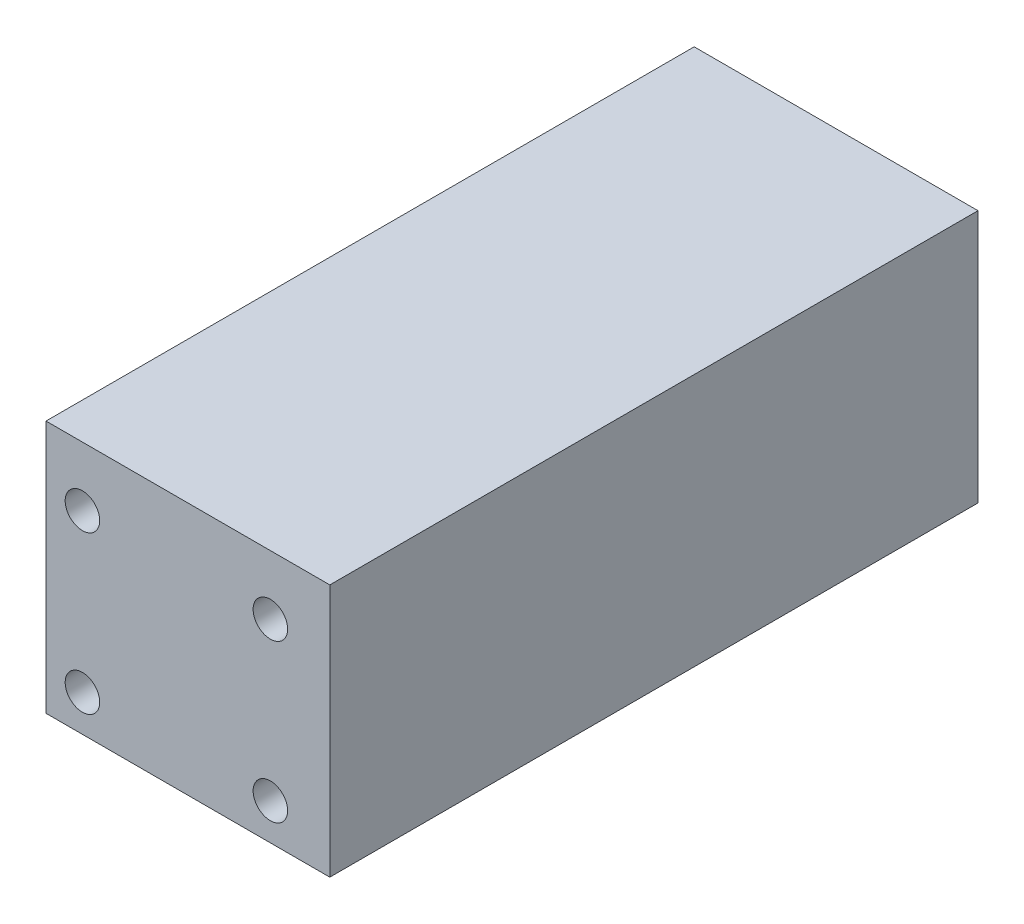
ISO-10303-21;
HEADER;
FILE_DESCRIPTION(('STEP AP214'),'2;1');
FILE_NAME('part.step','',(''),(''),'','','');
FILE_SCHEMA(('AUTOMOTIVE_DESIGN { 1 0 10303 214 1 1 1 1 }'));
ENDSEC;
DATA;
#1=APPLICATION_CONTEXT('core data for automotive mechanical design processes');
#2=APPLICATION_PROTOCOL_DEFINITION('international standard','automotive_design',2000,#1);
#3=PRODUCT_CONTEXT('',#1,'mechanical');
#4=PRODUCT('Part','Part','',(#3));
#5=PRODUCT_RELATED_PRODUCT_CATEGORY('part','',(#4));
#6=PRODUCT_DEFINITION_FORMATION('','',#4);
#7=PRODUCT_DEFINITION_CONTEXT('part definition',#1,'design');
#8=PRODUCT_DEFINITION('design','',#6,#7);
#9=PRODUCT_DEFINITION_SHAPE('','',#8);
#10=(LENGTH_UNIT() NAMED_UNIT(*) SI_UNIT(.MILLI.,.METRE.));
#11=(NAMED_UNIT(*) PLANE_ANGLE_UNIT() SI_UNIT($,.RADIAN.));
#12=(NAMED_UNIT(*) SI_UNIT($,.STERADIAN.) SOLID_ANGLE_UNIT());
#13=UNCERTAINTY_MEASURE_WITH_UNIT(LENGTH_MEASURE(1.E-05),#10,'distance_accuracy_value','');
#14=(GEOMETRIC_REPRESENTATION_CONTEXT(3) GLOBAL_UNCERTAINTY_ASSIGNED_CONTEXT((#13)) GLOBAL_UNIT_ASSIGNED_CONTEXT((#10,
#11,#12)) REPRESENTATION_CONTEXT('',''));
#15=CARTESIAN_POINT('',(0.,0.,0.));
#16=DIRECTION('',(0.,0.,1.));
#17=DIRECTION('',(1.,0.,0.));
#18=AXIS2_PLACEMENT_3D('',#15,#16,#17);
#19=CARTESIAN_POINT('',(34.,0.,134.078221024962));
#20=DIRECTION('',(-1.,0.,0.));
#21=DIRECTION('',(0.,-1.,0.));
#22=AXIS2_PLACEMENT_3D('',#19,#20,#21);
#23=PLANE('',#22);
#24=DIRECTION('',(0.,0.,-1.));
#25=VECTOR('',#24,1.);
#26=CARTESIAN_POINT('',(34.,0.,134.078221024962));
#27=LINE('',#26,#25);
#28=CARTESIAN_POINT('',(34.,0.,79.5));
#29=VERTEX_POINT('',#28);
#30=CARTESIAN_POINT('',(34.,0.,5.));
#31=VERTEX_POINT('',#30);
#32=EDGE_CURVE('E56',#29,#31,#27,.T.);
#33=ORIENTED_EDGE('',*,*,#32,.F.);
#34=DIRECTION('',(0.,1.,0.));
#35=VECTOR('',#34,1.);
#36=CARTESIAN_POINT('',(34.,0.,79.5));
#37=LINE('',#36,#35);
#38=CARTESIAN_POINT('',(34.,30.,79.5));
#39=VERTEX_POINT('',#38);
#40=EDGE_CURVE('E259',#29,#39,#37,.T.);
#41=ORIENTED_EDGE('',*,*,#40,.T.);
#42=DIRECTION('',(0.,0.,-1.));
#43=VECTOR('',#42,1.);
#44=CARTESIAN_POINT('',(34.,30.,134.078221024962));
#45=LINE('',#44,#43);
#46=CARTESIAN_POINT('',(34.,30.,5.));
#47=VERTEX_POINT('',#46);
#48=EDGE_CURVE('E150',#39,#47,#45,.T.);
#49=ORIENTED_EDGE('',*,*,#48,.T.);
#50=DIRECTION('',(0.,1.,0.));
#51=VECTOR('',#50,1.);
#52=CARTESIAN_POINT('',(34.,0.,5.));
#53=LINE('',#52,#51);
#54=EDGE_CURVE('E11',#31,#47,#53,.T.);
#55=ORIENTED_EDGE('',*,*,#54,.F.);
#56=EDGE_LOOP('',(#33,#41,#49,#55));
#57=FACE_BOUND('',#56,.T.);
#58=ADVANCED_FACE('F39',(#57),#23,.T.);
#59=CARTESIAN_POINT('',(34.,30.,134.078221024962));
#60=DIRECTION('',(0.,-1.,0.));
#61=DIRECTION('',(1.,0.,0.));
#62=AXIS2_PLACEMENT_3D('',#59,#60,#61);
#63=PLANE('',#62);
#64=ORIENTED_EDGE('',*,*,#48,.F.);
#65=DIRECTION('',(1.,0.,0.));
#66=VECTOR('',#65,1.);
#67=CARTESIAN_POINT('',(0.,30.,79.5));
#68=LINE('',#67,#66);
#69=CARTESIAN_POINT('',(0.,30.,79.5));
#70=VERTEX_POINT('',#69);
#71=EDGE_CURVE('E64',#70,#39,#68,.T.);
#72=ORIENTED_EDGE('',*,*,#71,.F.);
#73=DIRECTION('',(0.,0.,-1.));
#74=VECTOR('',#73,1.);
#75=CARTESIAN_POINT('',(0.,30.,134.078221024962));
#76=LINE('',#75,#74);
#77=CARTESIAN_POINT('',(0.,30.,5.00000000000001));
#78=VERTEX_POINT('',#77);
#79=EDGE_CURVE('E152',#70,#78,#76,.T.);
#80=ORIENTED_EDGE('',*,*,#79,.T.);
#81=DIRECTION('',(-1.,0.,0.));
#82=VECTOR('',#81,1.);
#83=CARTESIAN_POINT('',(0.,30.,5.));
#84=LINE('',#83,#82);
#85=EDGE_CURVE('E48',#47,#78,#84,.T.);
#86=ORIENTED_EDGE('',*,*,#85,.F.);
#87=EDGE_LOOP('',(#64,#72,#80,#86));
#88=FACE_BOUND('',#87,.T.);
#89=ADVANCED_FACE('F216',(#88),#63,.T.);
#90=CARTESIAN_POINT('',(0.,0.,5.));
#91=DIRECTION('',(0.,1.,0.));
#92=DIRECTION('',(0.,0.,1.));
#93=AXIS2_PLACEMENT_3D('',#90,#91,#92);
#94=PLANE('',#93);
#95=DIRECTION('',(1.,0.,0.));
#96=VECTOR('',#95,1.);
#97=CARTESIAN_POINT('',(0.,0.,0.));
#98=LINE('',#97,#96);
#99=CARTESIAN_POINT('',(0.,0.,0.));
#100=VERTEX_POINT('',#99);
#101=CARTESIAN_POINT('',(37.,0.,0.));
#102=VERTEX_POINT('',#101);
#103=EDGE_CURVE('E159',#100,#102,#98,.T.);
#104=ORIENTED_EDGE('',*,*,#103,.T.);
#105=DIRECTION('',(0.,0.,-1.));
#106=VECTOR('',#105,1.);
#107=CARTESIAN_POINT('',(37.,0.,134.078221024962));
#108=LINE('',#107,#106);
#109=CARTESIAN_POINT('',(37.,0.,84.5));
#110=VERTEX_POINT('',#109);
#111=EDGE_CURVE('E126',#110,#102,#108,.T.);
#112=ORIENTED_EDGE('',*,*,#111,.F.);
#113=DIRECTION('',(-1.,0.,0.));
#114=VECTOR('',#113,1.);
#115=CARTESIAN_POINT('',(37.,0.,84.5));
#116=LINE('',#115,#114);
#117=CARTESIAN_POINT('',(0.,0.,84.5));
#118=VERTEX_POINT('',#117);
#119=EDGE_CURVE('E110',#110,#118,#116,.T.);
#120=ORIENTED_EDGE('',*,*,#119,.T.);
#121=DIRECTION('',(0.,0.,-1.));
#122=VECTOR('',#121,1.);
#123=CARTESIAN_POINT('',(0.,0.,5.));
#124=LINE('',#123,#122);
#125=CARTESIAN_POINT('',(0.,0.,79.5));
#126=VERTEX_POINT('',#125);
#127=EDGE_CURVE('E124',#118,#126,#124,.T.);
#128=ORIENTED_EDGE('',*,*,#127,.T.);
#129=DIRECTION('',(1.,0.,0.));
#130=VECTOR('',#129,1.);
#131=CARTESIAN_POINT('',(0.,0.,79.5));
#132=LINE('',#131,#130);
#133=EDGE_CURVE('E260',#126,#29,#132,.T.);
#134=ORIENTED_EDGE('',*,*,#133,.T.);
#135=ORIENTED_EDGE('',*,*,#32,.T.);
#136=DIRECTION('',(-1.,0.,0.));
#137=VECTOR('',#136,1.);
#138=CARTESIAN_POINT('',(0.,0.,5.));
#139=LINE('',#138,#137);
#140=CARTESIAN_POINT('',(0.,0.,5.));
#141=VERTEX_POINT('',#140);
#142=EDGE_CURVE('E158',#31,#141,#139,.T.);
#143=ORIENTED_EDGE('',*,*,#142,.T.);
#144=DIRECTION('',(0.,0.,-1.));
#145=VECTOR('',#144,1.);
#146=CARTESIAN_POINT('',(0.,0.,5.));
#147=LINE('',#146,#145);
#148=EDGE_CURVE('E43',#141,#100,#147,.T.);
#149=ORIENTED_EDGE('',*,*,#148,.T.);
#150=EDGE_LOOP('',(#104,#112,#120,#128,#134,#135,#143,#149));
#151=FACE_BOUND('',#150,.T.);
#152=ADVANCED_FACE('F41',(#151),#94,.F.);
#153=CARTESIAN_POINT('',(4.75,25.25,5.));
#154=DIRECTION('',(0.,0.,-1.));
#155=DIRECTION('',(-1.,0.,0.));
#156=AXIS2_PLACEMENT_3D('',#153,#154,#155);
#157=CYLINDRICAL_SURFACE('',#156,2.25);
#158=CARTESIAN_POINT('',(4.75,25.25,5.));
#159=DIRECTION('',(0.,0.,-1.));
#160=DIRECTION('',(-1.,0.,0.));
#161=AXIS2_PLACEMENT_3D('',#158,#159,#160);
#162=CIRCLE('',#161,2.25);
#163=CARTESIAN_POINT('',(2.5,25.25,5.));
#164=VERTEX_POINT('',#163);
#165=EDGE_CURVE('E175',#164,#164,#162,.T.);
#166=ORIENTED_EDGE('',*,*,#165,.F.);
#167=EDGE_LOOP('',(#166));
#168=FACE_BOUND('',#167,.T.);
#169=CARTESIAN_POINT('',(4.75,25.25,0.));
#170=DIRECTION('',(0.,0.,1.));
#171=DIRECTION('',(1.,0.,0.));
#172=AXIS2_PLACEMENT_3D('',#169,#170,#171);
#173=CIRCLE('',#172,2.25);
#174=CARTESIAN_POINT('',(7.,25.25,0.));
#175=VERTEX_POINT('',#174);
#176=EDGE_CURVE('E162',#175,#175,#173,.T.);
#177=ORIENTED_EDGE('',*,*,#176,.F.);
#178=EDGE_LOOP('',(#177));
#179=FACE_BOUND('',#178,.T.);
#180=ADVANCED_FACE('F306',(#168,#179),#157,.F.);
#181=CARTESIAN_POINT('',(29.25,25.25,5.));
#182=DIRECTION('',(0.,0.,-1.));
#183=DIRECTION('',(-1.,0.,0.));
#184=AXIS2_PLACEMENT_3D('',#181,#182,#183);
#185=CYLINDRICAL_SURFACE('',#184,2.25000000000001);
#186=CARTESIAN_POINT('',(29.25,25.25,5.));
#187=DIRECTION('',(0.,0.,-1.));
#188=DIRECTION('',(-1.,0.,0.));
#189=AXIS2_PLACEMENT_3D('',#186,#187,#188);
#190=CIRCLE('',#189,2.25000000000001);
#191=CARTESIAN_POINT('',(27.,25.25,5.));
#192=VERTEX_POINT('',#191);
#193=EDGE_CURVE('E179',#192,#192,#190,.T.);
#194=ORIENTED_EDGE('',*,*,#193,.F.);
#195=EDGE_LOOP('',(#194));
#196=FACE_BOUND('',#195,.T.);
#197=CARTESIAN_POINT('',(29.25,25.25,0.));
#198=DIRECTION('',(0.,0.,1.));
#199=DIRECTION('',(1.,0.,0.));
#200=AXIS2_PLACEMENT_3D('',#197,#198,#199);
#201=CIRCLE('',#200,2.25000000000001);
#202=CARTESIAN_POINT('',(31.5,25.25,0.));
#203=VERTEX_POINT('',#202);
#204=EDGE_CURVE('E165',#203,#203,#201,.T.);
#205=ORIENTED_EDGE('',*,*,#204,.F.);
#206=EDGE_LOOP('',(#205));
#207=FACE_BOUND('',#206,.T.);
#208=ADVANCED_FACE('F303',(#196,#207),#185,.F.);
#209=CARTESIAN_POINT('',(29.25,4.75,5.));
#210=DIRECTION('',(0.,0.,-1.));
#211=DIRECTION('',(-1.,0.,0.));
#212=AXIS2_PLACEMENT_3D('',#209,#210,#211);
#213=CYLINDRICAL_SURFACE('',#212,2.25);
#214=CARTESIAN_POINT('',(29.25,4.75,5.));
#215=DIRECTION('',(0.,0.,-1.));
#216=DIRECTION('',(-1.,0.,0.));
#217=AXIS2_PLACEMENT_3D('',#214,#215,#216);
#218=CIRCLE('',#217,2.25);
#219=CARTESIAN_POINT('',(27.,4.75,5.));
#220=VERTEX_POINT('',#219);
#221=EDGE_CURVE('E182',#220,#220,#218,.T.);
#222=ORIENTED_EDGE('',*,*,#221,.F.);
#223=EDGE_LOOP('',(#222));
#224=FACE_BOUND('',#223,.T.);
#225=CARTESIAN_POINT('',(29.25,4.75,0.));
#226=DIRECTION('',(0.,0.,1.));
#227=DIRECTION('',(1.,0.,0.));
#228=AXIS2_PLACEMENT_3D('',#225,#226,#227);
#229=CIRCLE('',#228,2.25);
#230=CARTESIAN_POINT('',(31.5,4.75,0.));
#231=VERTEX_POINT('',#230);
#232=EDGE_CURVE('E166',#231,#231,#229,.T.);
#233=ORIENTED_EDGE('',*,*,#232,.F.);
#234=EDGE_LOOP('',(#233));
#235=FACE_BOUND('',#234,.T.);
#236=ADVANCED_FACE('F301',(#224,#235),#213,.F.);
#237=CARTESIAN_POINT('',(4.75,4.75,5.));
#238=DIRECTION('',(0.,0.,-1.));
#239=DIRECTION('',(-1.,0.,0.));
#240=AXIS2_PLACEMENT_3D('',#237,#238,#239);
#241=CYLINDRICAL_SURFACE('',#240,2.25);
#242=CARTESIAN_POINT('',(4.75,4.75,5.));
#243=DIRECTION('',(0.,0.,-1.));
#244=DIRECTION('',(-1.,0.,0.));
#245=AXIS2_PLACEMENT_3D('',#242,#243,#244);
#246=CIRCLE('',#245,2.25);
#247=CARTESIAN_POINT('',(2.5,4.75,5.));
#248=VERTEX_POINT('',#247);
#249=EDGE_CURVE('E185',#248,#248,#246,.T.);
#250=ORIENTED_EDGE('',*,*,#249,.F.);
#251=EDGE_LOOP('',(#250));
#252=FACE_BOUND('',#251,.T.);
#253=CARTESIAN_POINT('',(4.75,4.75,0.));
#254=DIRECTION('',(0.,0.,1.));
#255=DIRECTION('',(1.,0.,0.));
#256=AXIS2_PLACEMENT_3D('',#253,#254,#255);
#257=CIRCLE('',#256,2.25);
#258=CARTESIAN_POINT('',(7.,4.75,0.));
#259=VERTEX_POINT('',#258);
#260=EDGE_CURVE('E169',#259,#259,#257,.T.);
#261=ORIENTED_EDGE('',*,*,#260,.F.);
#262=EDGE_LOOP('',(#261));
#263=FACE_BOUND('',#262,.T.);
#264=ADVANCED_FACE('F298',(#252,#263),#241,.F.);
#265=CARTESIAN_POINT('',(0.,-36.,30.));
#266=DIRECTION('',(1.,0.,0.));
#267=DIRECTION('',(0.,0.,-1.));
#268=AXIS2_PLACEMENT_3D('',#265,#266,#267);
#269=PLANE('',#268);
#270=ORIENTED_EDGE('',*,*,#148,.F.);
#271=DIRECTION('',(0.,1.,0.));
#272=VECTOR('',#271,1.);
#273=CARTESIAN_POINT('',(0.,0.,5.));
#274=LINE('',#273,#272);
#275=EDGE_CURVE('E161',#141,#78,#274,.T.);
#276=ORIENTED_EDGE('',*,*,#275,.T.);
#277=ORIENTED_EDGE('',*,*,#79,.F.);
#278=DIRECTION('',(0.,1.,0.));
#279=VECTOR('',#278,1.);
#280=CARTESIAN_POINT('',(0.,0.,79.5));
#281=LINE('',#280,#279);
#282=EDGE_CURVE('E133',#126,#70,#281,.T.);
#283=ORIENTED_EDGE('',*,*,#282,.F.);
#284=ORIENTED_EDGE('',*,*,#127,.F.);
#285=DIRECTION('',(0.,1.,0.));
#286=VECTOR('',#285,1.);
#287=CARTESIAN_POINT('',(0.,30.,84.5));
#288=LINE('',#287,#286);
#289=CARTESIAN_POINT('',(0.,33.,84.5));
#290=VERTEX_POINT('',#289);
#291=EDGE_CURVE('E106',#118,#290,#288,.T.);
#292=ORIENTED_EDGE('',*,*,#291,.T.);
#293=DIRECTION('',(0.,0.,-1.));
#294=VECTOR('',#293,1.);
#295=CARTESIAN_POINT('',(0.,33.,134.078221024962));
#296=LINE('',#295,#294);
#297=CARTESIAN_POINT('',(0.,33.,0.));
#298=VERTEX_POINT('',#297);
#299=EDGE_CURVE('E118',#290,#298,#296,.T.);
#300=ORIENTED_EDGE('',*,*,#299,.T.);
#301=DIRECTION('',(0.,1.,0.));
#302=VECTOR('',#301,1.);
#303=CARTESIAN_POINT('',(0.,-36.,0.));
#304=LINE('',#303,#302);
#305=EDGE_CURVE('E172',#100,#298,#304,.T.);
#306=ORIENTED_EDGE('',*,*,#305,.F.);
#307=EDGE_LOOP('',(#270,#276,#277,#283,#284,#292,#300,#306));
#308=FACE_BOUND('',#307,.T.);
#309=ADVANCED_FACE('F131',(#308),#269,.F.);
#310=CARTESIAN_POINT('',(0.,0.,0.));
#311=DIRECTION('',(0.,0.,-1.));
#312=DIRECTION('',(-1.,0.,0.));
#313=AXIS2_PLACEMENT_3D('',#310,#311,#312);
#314=PLANE('',#313);
#315=ORIENTED_EDGE('',*,*,#305,.T.);
#316=DIRECTION('',(1.,0.,0.));
#317=VECTOR('',#316,1.);
#318=CARTESIAN_POINT('',(0.,33.,0.));
#319=LINE('',#318,#317);
#320=CARTESIAN_POINT('',(37.,33.,0.));
#321=VERTEX_POINT('',#320);
#322=EDGE_CURVE('E134',#298,#321,#319,.T.);
#323=ORIENTED_EDGE('',*,*,#322,.T.);
#324=DIRECTION('',(0.,-1.,0.));
#325=VECTOR('',#324,1.);
#326=CARTESIAN_POINT('',(37.,33.,0.));
#327=LINE('',#326,#325);
#328=EDGE_CURVE('E119',#321,#102,#327,.T.);
#329=ORIENTED_EDGE('',*,*,#328,.T.);
#330=ORIENTED_EDGE('',*,*,#103,.F.);
#331=EDGE_LOOP('',(#315,#323,#329,#330));
#332=FACE_BOUND('',#331,.T.);
#333=ORIENTED_EDGE('',*,*,#232,.T.);
#334=EDGE_LOOP('',(#333));
#335=FACE_BOUND('',#334,.T.);
#336=ORIENTED_EDGE('',*,*,#176,.T.);
#337=EDGE_LOOP('',(#336));
#338=FACE_BOUND('',#337,.T.);
#339=ORIENTED_EDGE('',*,*,#204,.T.);
#340=EDGE_LOOP('',(#339));
#341=FACE_BOUND('',#340,.T.);
#342=ORIENTED_EDGE('',*,*,#260,.T.);
#343=EDGE_LOOP('',(#342));
#344=FACE_BOUND('',#343,.T.);
#345=ADVANCED_FACE('F197',(#332,#335,#338,#341,#344),#314,.T.);
#346=CARTESIAN_POINT('',(0.,0.,5.));
#347=DIRECTION('',(0.,0.,-1.));
#348=DIRECTION('',(-1.,0.,0.));
#349=AXIS2_PLACEMENT_3D('',#346,#347,#348);
#350=PLANE('',#349);
#351=ORIENTED_EDGE('',*,*,#165,.T.);
#352=EDGE_LOOP('',(#351));
#353=FACE_BOUND('',#352,.T.);
#354=ORIENTED_EDGE('',*,*,#193,.T.);
#355=EDGE_LOOP('',(#354));
#356=FACE_BOUND('',#355,.T.);
#357=ORIENTED_EDGE('',*,*,#221,.T.);
#358=EDGE_LOOP('',(#357));
#359=FACE_BOUND('',#358,.T.);
#360=ORIENTED_EDGE('',*,*,#249,.T.);
#361=EDGE_LOOP('',(#360));
#362=FACE_BOUND('',#361,.T.);
#363=ORIENTED_EDGE('',*,*,#85,.T.);
#364=ORIENTED_EDGE('',*,*,#275,.F.);
#365=ORIENTED_EDGE('',*,*,#142,.F.);
#366=ORIENTED_EDGE('',*,*,#54,.T.);
#367=EDGE_LOOP('',(#363,#364,#365,#366));
#368=FACE_BOUND('',#367,.T.);
#369=ADVANCED_FACE('F213',(#353,#356,#359,#362,#368),#350,.F.);
#370=CARTESIAN_POINT('',(0.,0.,84.5));
#371=DIRECTION('',(0.,0.,1.));
#372=DIRECTION('',(1.,0.,0.));
#373=AXIS2_PLACEMENT_3D('',#370,#371,#372);
#374=PLANE('',#373);
#375=ORIENTED_EDGE('',*,*,#291,.F.);
#376=ORIENTED_EDGE('',*,*,#119,.F.);
#377=DIRECTION('',(0.,-1.,0.));
#378=VECTOR('',#377,1.);
#379=CARTESIAN_POINT('',(37.,33.,84.5));
#380=LINE('',#379,#378);
#381=CARTESIAN_POINT('',(37.,33.,84.5));
#382=VERTEX_POINT('',#381);
#383=EDGE_CURVE('E146',#382,#110,#380,.T.);
#384=ORIENTED_EDGE('',*,*,#383,.F.);
#385=DIRECTION('',(1.,0.,0.));
#386=VECTOR('',#385,1.);
#387=CARTESIAN_POINT('',(0.,33.,84.5));
#388=LINE('',#387,#386);
#389=EDGE_CURVE('E113',#290,#382,#388,.T.);
#390=ORIENTED_EDGE('',*,*,#389,.F.);
#391=EDGE_LOOP('',(#375,#376,#384,#390));
#392=FACE_BOUND('',#391,.T.);
#393=CARTESIAN_POINT('',(29.25,4.75,84.5));
#394=DIRECTION('',(0.,0.,1.));
#395=DIRECTION('',(1.,0.,0.));
#396=AXIS2_PLACEMENT_3D('',#393,#394,#395);
#397=CIRCLE('',#396,2.25);
#398=CARTESIAN_POINT('',(31.5,4.75,84.5));
#399=VERTEX_POINT('',#398);
#400=EDGE_CURVE('E273',#399,#399,#397,.T.);
#401=ORIENTED_EDGE('',*,*,#400,.F.);
#402=EDGE_LOOP('',(#401));
#403=FACE_BOUND('',#402,.T.);
#404=CARTESIAN_POINT('',(4.75,25.25,84.5));
#405=DIRECTION('',(0.,0.,1.));
#406=DIRECTION('',(1.,0.,0.));
#407=AXIS2_PLACEMENT_3D('',#404,#405,#406);
#408=CIRCLE('',#407,2.25);
#409=CARTESIAN_POINT('',(7.,25.25,84.5));
#410=VERTEX_POINT('',#409);
#411=EDGE_CURVE('E135',#410,#410,#408,.T.);
#412=ORIENTED_EDGE('',*,*,#411,.F.);
#413=EDGE_LOOP('',(#412));
#414=FACE_BOUND('',#413,.T.);
#415=CARTESIAN_POINT('',(29.25,25.25,84.5));
#416=DIRECTION('',(0.,0.,1.));
#417=DIRECTION('',(1.,0.,0.));
#418=AXIS2_PLACEMENT_3D('',#415,#416,#417);
#419=CIRCLE('',#418,2.25000000000001);
#420=CARTESIAN_POINT('',(31.5,25.25,84.5));
#421=VERTEX_POINT('',#420);
#422=EDGE_CURVE('E140',#421,#421,#419,.T.);
#423=ORIENTED_EDGE('',*,*,#422,.F.);
#424=EDGE_LOOP('',(#423));
#425=FACE_BOUND('',#424,.T.);
#426=CARTESIAN_POINT('',(4.75,4.75,84.5));
#427=DIRECTION('',(0.,0.,1.));
#428=DIRECTION('',(1.,0.,0.));
#429=AXIS2_PLACEMENT_3D('',#426,#427,#428);
#430=CIRCLE('',#429,2.25);
#431=CARTESIAN_POINT('',(7.,4.75,84.5));
#432=VERTEX_POINT('',#431);
#433=EDGE_CURVE('E270',#432,#432,#430,.T.);
#434=ORIENTED_EDGE('',*,*,#433,.F.);
#435=EDGE_LOOP('',(#434));
#436=FACE_BOUND('',#435,.T.);
#437=ADVANCED_FACE('F108',(#392,#403,#414,#425,#436),#374,.T.);
#438=CARTESIAN_POINT('',(0.,33.,134.078221024962));
#439=DIRECTION('',(0.,1.,0.));
#440=DIRECTION('',(-1.,0.,0.));
#441=AXIS2_PLACEMENT_3D('',#438,#439,#440);
#442=PLANE('',#441);
#443=ORIENTED_EDGE('',*,*,#299,.F.);
#444=ORIENTED_EDGE('',*,*,#389,.T.);
#445=DIRECTION('',(0.,0.,-1.));
#446=VECTOR('',#445,1.);
#447=CARTESIAN_POINT('',(37.,33.,134.078221024962));
#448=LINE('',#447,#446);
#449=EDGE_CURVE('E148',#382,#321,#448,.T.);
#450=ORIENTED_EDGE('',*,*,#449,.T.);
#451=ORIENTED_EDGE('',*,*,#322,.F.);
#452=EDGE_LOOP('',(#443,#444,#450,#451));
#453=FACE_BOUND('',#452,.T.);
#454=ADVANCED_FACE('F204',(#453),#442,.T.);
#455=CARTESIAN_POINT('',(37.,33.,134.078221024962));
#456=DIRECTION('',(1.,0.,0.));
#457=DIRECTION('',(0.,1.,0.));
#458=AXIS2_PLACEMENT_3D('',#455,#456,#457);
#459=PLANE('',#458);
#460=ORIENTED_EDGE('',*,*,#449,.F.);
#461=ORIENTED_EDGE('',*,*,#383,.T.);
#462=ORIENTED_EDGE('',*,*,#111,.T.);
#463=ORIENTED_EDGE('',*,*,#328,.F.);
#464=EDGE_LOOP('',(#460,#461,#462,#463));
#465=FACE_BOUND('',#464,.T.);
#466=ADVANCED_FACE('F202',(#465),#459,.T.);
#467=CARTESIAN_POINT('',(4.75,4.75,5.));
#468=DIRECTION('',(0.,0.,-1.));
#469=DIRECTION('',(-1.,0.,0.));
#470=AXIS2_PLACEMENT_3D('',#467,#468,#469);
#471=CYLINDRICAL_SURFACE('',#470,2.25);
#472=CARTESIAN_POINT('',(4.75,4.75,79.5));
#473=DIRECTION('',(0.,0.,1.));
#474=DIRECTION('',(1.,0.,0.));
#475=AXIS2_PLACEMENT_3D('',#472,#473,#474);
#476=CIRCLE('',#475,2.25);
#477=CARTESIAN_POINT('',(7.,4.75,79.5));
#478=VERTEX_POINT('',#477);
#479=EDGE_CURVE('E258',#478,#478,#476,.T.);
#480=ORIENTED_EDGE('',*,*,#479,.F.);
#481=EDGE_LOOP('',(#480));
#482=FACE_BOUND('',#481,.T.);
#483=ORIENTED_EDGE('',*,*,#433,.T.);
#484=EDGE_LOOP('',(#483));
#485=FACE_BOUND('',#484,.T.);
#486=ADVANCED_FACE('F211',(#482,#485),#471,.F.);
#487=CARTESIAN_POINT('',(29.25,25.25,5.));
#488=DIRECTION('',(0.,0.,-1.));
#489=DIRECTION('',(-1.,0.,0.));
#490=AXIS2_PLACEMENT_3D('',#487,#488,#489);
#491=CYLINDRICAL_SURFACE('',#490,2.25000000000001);
#492=CARTESIAN_POINT('',(29.25,25.25,79.5));
#493=DIRECTION('',(0.,0.,1.));
#494=DIRECTION('',(1.,0.,0.));
#495=AXIS2_PLACEMENT_3D('',#492,#493,#494);
#496=CIRCLE('',#495,2.25000000000001);
#497=CARTESIAN_POINT('',(31.5,25.25,79.5));
#498=VERTEX_POINT('',#497);
#499=EDGE_CURVE('E250',#498,#498,#496,.T.);
#500=ORIENTED_EDGE('',*,*,#499,.F.);
#501=EDGE_LOOP('',(#500));
#502=FACE_BOUND('',#501,.T.);
#503=ORIENTED_EDGE('',*,*,#422,.T.);
#504=EDGE_LOOP('',(#503));
#505=FACE_BOUND('',#504,.T.);
#506=ADVANCED_FACE('F227',(#502,#505),#491,.F.);
#507=CARTESIAN_POINT('',(4.75,25.25,5.));
#508=DIRECTION('',(0.,0.,-1.));
#509=DIRECTION('',(-1.,0.,0.));
#510=AXIS2_PLACEMENT_3D('',#507,#508,#509);
#511=CYLINDRICAL_SURFACE('',#510,2.25);
#512=CARTESIAN_POINT('',(4.75,25.25,79.5));
#513=DIRECTION('',(0.,0.,1.));
#514=DIRECTION('',(1.,0.,0.));
#515=AXIS2_PLACEMENT_3D('',#512,#513,#514);
#516=CIRCLE('',#515,2.25);
#517=CARTESIAN_POINT('',(7.,25.25,79.5));
#518=VERTEX_POINT('',#517);
#519=EDGE_CURVE('E246',#518,#518,#516,.T.);
#520=ORIENTED_EDGE('',*,*,#519,.F.);
#521=EDGE_LOOP('',(#520));
#522=FACE_BOUND('',#521,.T.);
#523=ORIENTED_EDGE('',*,*,#411,.T.);
#524=EDGE_LOOP('',(#523));
#525=FACE_BOUND('',#524,.T.);
#526=ADVANCED_FACE('F223',(#522,#525),#511,.F.);
#527=CARTESIAN_POINT('',(29.25,4.75,5.));
#528=DIRECTION('',(0.,0.,-1.));
#529=DIRECTION('',(-1.,0.,0.));
#530=AXIS2_PLACEMENT_3D('',#527,#528,#529);
#531=CYLINDRICAL_SURFACE('',#530,2.25);
#532=CARTESIAN_POINT('',(29.25,4.75,79.5));
#533=DIRECTION('',(0.,0.,1.));
#534=DIRECTION('',(1.,0.,0.));
#535=AXIS2_PLACEMENT_3D('',#532,#533,#534);
#536=CIRCLE('',#535,2.25);
#537=CARTESIAN_POINT('',(31.5,4.75,79.5));
#538=VERTEX_POINT('',#537);
#539=EDGE_CURVE('E254',#538,#538,#536,.T.);
#540=ORIENTED_EDGE('',*,*,#539,.F.);
#541=EDGE_LOOP('',(#540));
#542=FACE_BOUND('',#541,.T.);
#543=ORIENTED_EDGE('',*,*,#400,.T.);
#544=EDGE_LOOP('',(#543));
#545=FACE_BOUND('',#544,.T.);
#546=ADVANCED_FACE('F226',(#542,#545),#531,.F.);
#547=CARTESIAN_POINT('',(0.,0.,79.5));
#548=DIRECTION('',(0.,0.,1.));
#549=DIRECTION('',(1.,0.,0.));
#550=AXIS2_PLACEMENT_3D('',#547,#548,#549);
#551=PLANE('',#550);
#552=ORIENTED_EDGE('',*,*,#519,.T.);
#553=EDGE_LOOP('',(#552));
#554=FACE_BOUND('',#553,.T.);
#555=ORIENTED_EDGE('',*,*,#499,.T.);
#556=EDGE_LOOP('',(#555));
#557=FACE_BOUND('',#556,.T.);
#558=ORIENTED_EDGE('',*,*,#539,.T.);
#559=EDGE_LOOP('',(#558));
#560=FACE_BOUND('',#559,.T.);
#561=ORIENTED_EDGE('',*,*,#479,.T.);
#562=EDGE_LOOP('',(#561));
#563=FACE_BOUND('',#562,.T.);
#564=ORIENTED_EDGE('',*,*,#71,.T.);
#565=ORIENTED_EDGE('',*,*,#40,.F.);
#566=ORIENTED_EDGE('',*,*,#133,.F.);
#567=ORIENTED_EDGE('',*,*,#282,.T.);
#568=EDGE_LOOP('',(#564,#565,#566,#567));
#569=FACE_BOUND('',#568,.T.);
#570=ADVANCED_FACE('F234',(#554,#557,#560,#563,#569),#551,.F.);
#571=CLOSED_SHELL('',(#58,#89,#152,#180,#208,#236,#264,#309,#345,#369,#437,#454,#466,#486,#506,
#526,#546,#570));
#572=MANIFOLD_SOLID_BREP('B2',#571);
#573=ADVANCED_BREP_SHAPE_REPRESENTATION('',(#18,#572),#14);
#574=SHAPE_DEFINITION_REPRESENTATION(#9,#573);
ENDSEC;
END-ISO-10303-21;
